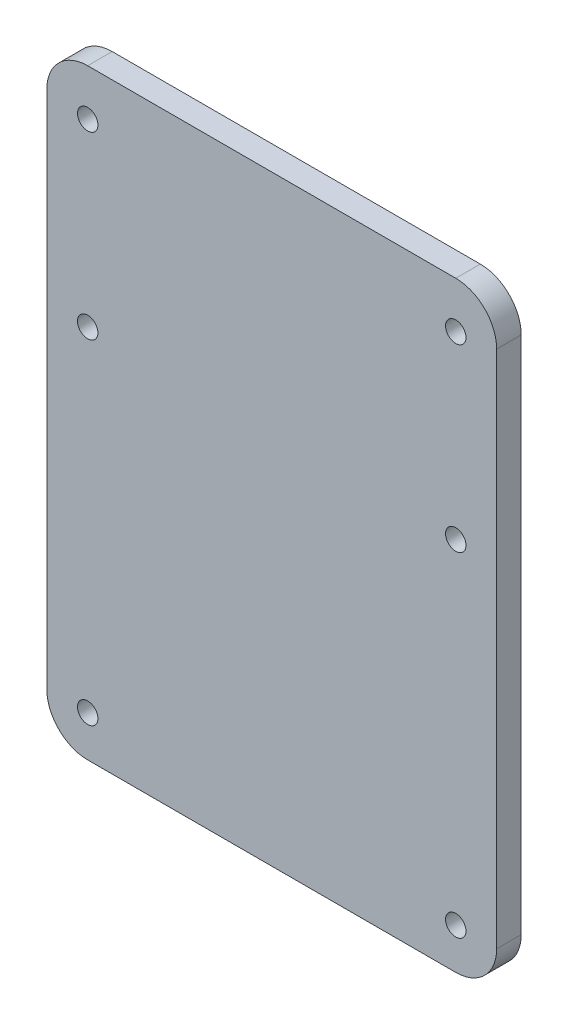
ISO-10303-21;
HEADER;
FILE_DESCRIPTION(('STEP AP214'),'2;1');
FILE_NAME('part.step','',(''),(''),'','','');
FILE_SCHEMA(('AUTOMOTIVE_DESIGN { 1 0 10303 214 1 1 1 1 }'));
ENDSEC;
DATA;
#1=APPLICATION_CONTEXT('core data for automotive mechanical design processes');
#2=APPLICATION_PROTOCOL_DEFINITION('international standard','automotive_design',2000,#1);
#3=PRODUCT_CONTEXT('',#1,'mechanical');
#4=PRODUCT('Part','Part','',(#3));
#5=PRODUCT_RELATED_PRODUCT_CATEGORY('part','',(#4));
#6=PRODUCT_DEFINITION_FORMATION('','',#4);
#7=PRODUCT_DEFINITION_CONTEXT('part definition',#1,'design');
#8=PRODUCT_DEFINITION('design','',#6,#7);
#9=PRODUCT_DEFINITION_SHAPE('','',#8);
#10=(LENGTH_UNIT() NAMED_UNIT(*) SI_UNIT(.MILLI.,.METRE.));
#11=(NAMED_UNIT(*) PLANE_ANGLE_UNIT() SI_UNIT($,.RADIAN.));
#12=(NAMED_UNIT(*) SI_UNIT($,.STERADIAN.) SOLID_ANGLE_UNIT());
#13=UNCERTAINTY_MEASURE_WITH_UNIT(LENGTH_MEASURE(1.E-05),#10,'distance_accuracy_value','');
#14=(GEOMETRIC_REPRESENTATION_CONTEXT(3) GLOBAL_UNCERTAINTY_ASSIGNED_CONTEXT((#13)) GLOBAL_UNIT_ASSIGNED_CONTEXT((#10,
#11,#12)) REPRESENTATION_CONTEXT('',''));
#15=CARTESIAN_POINT('',(0.,0.,0.));
#16=DIRECTION('',(0.,0.,1.));
#17=DIRECTION('',(1.,0.,0.));
#18=AXIS2_PLACEMENT_3D('',#15,#16,#17);
#19=CARTESIAN_POINT('',(-25.7371794871795,42.2489316239316,3.));
#20=DIRECTION('',(1.,0.,0.));
#21=DIRECTION('',(0.,1.,0.));
#22=AXIS2_PLACEMENT_3D('',#19,#20,#21);
#23=PLANE('',#22);
#24=DIRECTION('',(0.,-1.,0.));
#25=VECTOR('',#24,1.);
#26=CARTESIAN_POINT('',(-25.7371794871795,42.2489316239316,0.));
#27=LINE('',#26,#25);
#28=CARTESIAN_POINT('',(-25.7371794871795,37.2489316239316,0.));
#29=VERTEX_POINT('',#28);
#30=CARTESIAN_POINT('',(-25.7371794871795,-26.2510683760684,0.));
#31=VERTEX_POINT('',#30);
#32=EDGE_CURVE('E146',#29,#31,#27,.T.);
#33=ORIENTED_EDGE('',*,*,#32,.T.);
#34=DIRECTION('',(0.,0.,-1.));
#35=VECTOR('',#34,1.);
#36=CARTESIAN_POINT('',(-25.7371794871795,-26.2510683760684,3.));
#37=LINE('',#36,#35);
#38=CARTESIAN_POINT('',(-25.7371794871795,-26.2510683760684,3.));
#39=VERTEX_POINT('',#38);
#40=EDGE_CURVE('E180',#31,#39,#37,.F.);
#41=ORIENTED_EDGE('',*,*,#40,.T.);
#42=DIRECTION('',(0.,-1.,0.));
#43=VECTOR('',#42,1.);
#44=CARTESIAN_POINT('',(-25.7371794871795,42.2489316239316,3.));
#45=LINE('',#44,#43);
#46=CARTESIAN_POINT('',(-25.7371794871795,37.2489316239316,3.));
#47=VERTEX_POINT('',#46);
#48=EDGE_CURVE('E144',#47,#39,#45,.T.);
#49=ORIENTED_EDGE('',*,*,#48,.F.);
#50=DIRECTION('',(0.,0.,-1.));
#51=VECTOR('',#50,1.);
#52=CARTESIAN_POINT('',(-25.7371794871795,37.2489316239316,3.));
#53=LINE('',#52,#51);
#54=EDGE_CURVE('E176',#47,#29,#53,.T.);
#55=ORIENTED_EDGE('',*,*,#54,.T.);
#56=EDGE_LOOP('',(#33,#41,#49,#55));
#57=FACE_BOUND('',#56,.T.);
#58=ADVANCED_FACE('F45',(#57),#23,.F.);
#59=CARTESIAN_POINT('',(-25.7371794871795,-31.2510683760684,3.));
#60=DIRECTION('',(0.,1.,0.));
#61=DIRECTION('',(0.,0.,1.));
#62=AXIS2_PLACEMENT_3D('',#59,#60,#61);
#63=PLANE('',#62);
#64=DIRECTION('',(1.,0.,0.));
#65=VECTOR('',#64,1.);
#66=CARTESIAN_POINT('',(-25.7371794871795,-31.2510683760684,0.));
#67=LINE('',#66,#65);
#68=CARTESIAN_POINT('',(-20.7371794871795,-31.2510683760684,0.));
#69=VERTEX_POINT('',#68);
#70=CARTESIAN_POINT('',(24.2628205128205,-31.2510683760684,0.));
#71=VERTEX_POINT('',#70);
#72=EDGE_CURVE('E140',#69,#71,#67,.T.);
#73=ORIENTED_EDGE('',*,*,#72,.T.);
#74=DIRECTION('',(0.,0.,-1.));
#75=VECTOR('',#74,1.);
#76=CARTESIAN_POINT('',(24.2628205128205,-31.2510683760684,3.));
#77=LINE('',#76,#75);
#78=CARTESIAN_POINT('',(24.2628205128205,-31.2510683760684,3.));
#79=VERTEX_POINT('',#78);
#80=EDGE_CURVE('E116',#71,#79,#77,.F.);
#81=ORIENTED_EDGE('',*,*,#80,.T.);
#82=DIRECTION('',(1.,0.,0.));
#83=VECTOR('',#82,1.);
#84=CARTESIAN_POINT('',(-25.7371794871795,-31.2510683760684,3.));
#85=LINE('',#84,#83);
#86=CARTESIAN_POINT('',(-20.7371794871795,-31.2510683760684,3.));
#87=VERTEX_POINT('',#86);
#88=EDGE_CURVE('E199',#87,#79,#85,.T.);
#89=ORIENTED_EDGE('',*,*,#88,.F.);
#90=DIRECTION('',(0.,0.,-1.));
#91=VECTOR('',#90,1.);
#92=CARTESIAN_POINT('',(-20.7371794871795,-31.2510683760684,3.));
#93=LINE('',#92,#91);
#94=EDGE_CURVE('E122',#87,#69,#93,.T.);
#95=ORIENTED_EDGE('',*,*,#94,.T.);
#96=EDGE_LOOP('',(#73,#81,#89,#95));
#97=FACE_BOUND('',#96,.T.);
#98=ADVANCED_FACE('F272',(#97),#63,.F.);
#99=CARTESIAN_POINT('',(29.2628205128205,42.2489316239316,3.));
#100=DIRECTION('',(-1.,0.,0.));
#101=DIRECTION('',(0.,-1.,0.));
#102=AXIS2_PLACEMENT_3D('',#99,#100,#101);
#103=PLANE('',#102);
#104=DIRECTION('',(0.,1.,0.));
#105=VECTOR('',#104,1.);
#106=CARTESIAN_POINT('',(29.2628205128205,42.2489316239316,3.));
#107=LINE('',#106,#105);
#108=CARTESIAN_POINT('',(29.2628205128205,-26.2510683760684,3.));
#109=VERTEX_POINT('',#108);
#110=CARTESIAN_POINT('',(29.2628205128205,37.2489316239316,3.));
#111=VERTEX_POINT('',#110);
#112=EDGE_CURVE('E131',#109,#111,#107,.T.);
#113=ORIENTED_EDGE('',*,*,#112,.F.);
#114=DIRECTION('',(0.,0.,-1.));
#115=VECTOR('',#114,1.);
#116=CARTESIAN_POINT('',(29.2628205128205,-26.2510683760684,3.));
#117=LINE('',#116,#115);
#118=CARTESIAN_POINT('',(29.2628205128205,-26.2510683760684,0.));
#119=VERTEX_POINT('',#118);
#120=EDGE_CURVE('E115',#109,#119,#117,.T.);
#121=ORIENTED_EDGE('',*,*,#120,.T.);
#122=DIRECTION('',(0.,1.,0.));
#123=VECTOR('',#122,1.);
#124=CARTESIAN_POINT('',(29.2628205128205,42.2489316239316,0.));
#125=LINE('',#124,#123);
#126=CARTESIAN_POINT('',(29.2628205128205,37.2489316239316,0.));
#127=VERTEX_POINT('',#126);
#128=EDGE_CURVE('E129',#119,#127,#125,.T.);
#129=ORIENTED_EDGE('',*,*,#128,.T.);
#130=DIRECTION('',(0.,0.,-1.));
#131=VECTOR('',#130,1.);
#132=CARTESIAN_POINT('',(29.2628205128205,37.2489316239316,3.));
#133=LINE('',#132,#131);
#134=EDGE_CURVE('E134',#127,#111,#133,.F.);
#135=ORIENTED_EDGE('',*,*,#134,.T.);
#136=EDGE_LOOP('',(#113,#121,#129,#135));
#137=FACE_BOUND('',#136,.T.);
#138=ADVANCED_FACE('F128',(#137),#103,.F.);
#139=CARTESIAN_POINT('',(-25.7371794871795,42.2489316239316,3.));
#140=DIRECTION('',(0.,-1.,0.));
#141=DIRECTION('',(0.,0.,-1.));
#142=AXIS2_PLACEMENT_3D('',#139,#140,#141);
#143=PLANE('',#142);
#144=DIRECTION('',(-1.,0.,0.));
#145=VECTOR('',#144,1.);
#146=CARTESIAN_POINT('',(-25.7371794871795,42.2489316239316,0.));
#147=LINE('',#146,#145);
#148=CARTESIAN_POINT('',(24.2628205128205,42.2489316239316,0.));
#149=VERTEX_POINT('',#148);
#150=CARTESIAN_POINT('',(-20.7371794871795,42.2489316239316,0.));
#151=VERTEX_POINT('',#150);
#152=EDGE_CURVE('E139',#149,#151,#147,.T.);
#153=ORIENTED_EDGE('',*,*,#152,.T.);
#154=DIRECTION('',(0.,0.,-1.));
#155=VECTOR('',#154,1.);
#156=CARTESIAN_POINT('',(-20.7371794871795,42.2489316239316,3.));
#157=LINE('',#156,#155);
#158=CARTESIAN_POINT('',(-20.7371794871795,42.2489316239316,3.));
#159=VERTEX_POINT('',#158);
#160=EDGE_CURVE('E11',#151,#159,#157,.F.);
#161=ORIENTED_EDGE('',*,*,#160,.T.);
#162=DIRECTION('',(-1.,0.,0.));
#163=VECTOR('',#162,1.);
#164=CARTESIAN_POINT('',(-25.7371794871795,42.2489316239316,3.));
#165=LINE('',#164,#163);
#166=CARTESIAN_POINT('',(24.2628205128205,42.2489316239316,3.));
#167=VERTEX_POINT('',#166);
#168=EDGE_CURVE('E151',#167,#159,#165,.T.);
#169=ORIENTED_EDGE('',*,*,#168,.F.);
#170=DIRECTION('',(0.,0.,-1.));
#171=VECTOR('',#170,1.);
#172=CARTESIAN_POINT('',(24.2628205128205,42.2489316239316,3.));
#173=LINE('',#172,#171);
#174=EDGE_CURVE('E54',#167,#149,#173,.T.);
#175=ORIENTED_EDGE('',*,*,#174,.T.);
#176=EDGE_LOOP('',(#153,#161,#169,#175));
#177=FACE_BOUND('',#176,.T.);
#178=ADVANCED_FACE('F185',(#177),#143,.F.);
#179=CARTESIAN_POINT('',(0.,0.,3.));
#180=DIRECTION('',(0.,0.,1.));
#181=DIRECTION('',(1.,0.,0.));
#182=AXIS2_PLACEMENT_3D('',#179,#180,#181);
#183=PLANE('',#182);
#184=CARTESIAN_POINT('',(-20.7371794871795,-26.2510683760684,3.));
#185=DIRECTION('',(0.,0.,1.));
#186=DIRECTION('',(1.,0.,0.));
#187=AXIS2_PLACEMENT_3D('',#184,#185,#186);
#188=CIRCLE('',#187,1.25);
#189=CARTESIAN_POINT('',(-19.4871794871795,-26.2510683760684,3.));
#190=VERTEX_POINT('',#189);
#191=EDGE_CURVE('E241',#190,#190,#188,.T.);
#192=ORIENTED_EDGE('',*,*,#191,.F.);
#193=EDGE_LOOP('',(#192));
#194=FACE_BOUND('',#193,.T.);
#195=CARTESIAN_POINT('',(24.2628205128205,14.58796733645,3.));
#196=DIRECTION('',(0.,0.,1.));
#197=DIRECTION('',(1.,0.,0.));
#198=AXIS2_PLACEMENT_3D('',#195,#196,#197);
#199=CIRCLE('',#198,1.25);
#200=CARTESIAN_POINT('',(25.5128205128205,14.58796733645,3.));
#201=VERTEX_POINT('',#200);
#202=EDGE_CURVE('E226',#201,#201,#199,.T.);
#203=ORIENTED_EDGE('',*,*,#202,.F.);
#204=EDGE_LOOP('',(#203));
#205=FACE_BOUND('',#204,.T.);
#206=CARTESIAN_POINT('',(-20.7371794871795,14.58796733645,3.));
#207=DIRECTION('',(0.,0.,1.));
#208=DIRECTION('',(1.,0.,0.));
#209=AXIS2_PLACEMENT_3D('',#206,#207,#208);
#210=CIRCLE('',#209,1.25);
#211=CARTESIAN_POINT('',(-19.4871794871795,14.58796733645,3.));
#212=VERTEX_POINT('',#211);
#213=EDGE_CURVE('E225',#212,#212,#210,.T.);
#214=ORIENTED_EDGE('',*,*,#213,.F.);
#215=EDGE_LOOP('',(#214));
#216=FACE_BOUND('',#215,.T.);
#217=CARTESIAN_POINT('',(24.2628205128205,36.58796733645,3.));
#218=DIRECTION('',(0.,0.,1.));
#219=DIRECTION('',(1.,0.,0.));
#220=AXIS2_PLACEMENT_3D('',#217,#218,#219);
#221=CIRCLE('',#220,1.25);
#222=CARTESIAN_POINT('',(25.5128205128205,36.58796733645,3.));
#223=VERTEX_POINT('',#222);
#224=EDGE_CURVE('E219',#223,#223,#221,.T.);
#225=ORIENTED_EDGE('',*,*,#224,.F.);
#226=EDGE_LOOP('',(#225));
#227=FACE_BOUND('',#226,.T.);
#228=CARTESIAN_POINT('',(24.2628205128205,-26.2510683760684,3.));
#229=DIRECTION('',(0.,0.,1.));
#230=DIRECTION('',(1.,0.,0.));
#231=AXIS2_PLACEMENT_3D('',#228,#229,#230);
#232=CIRCLE('',#231,1.25);
#233=CARTESIAN_POINT('',(25.5128205128205,-26.2510683760684,3.));
#234=VERTEX_POINT('',#233);
#235=EDGE_CURVE('E242',#234,#234,#232,.T.);
#236=ORIENTED_EDGE('',*,*,#235,.F.);
#237=EDGE_LOOP('',(#236));
#238=FACE_BOUND('',#237,.T.);
#239=CARTESIAN_POINT('',(-20.7371794871795,36.58796733645,3.));
#240=DIRECTION('',(0.,0.,1.));
#241=DIRECTION('',(1.,0.,0.));
#242=AXIS2_PLACEMENT_3D('',#239,#240,#241);
#243=CIRCLE('',#242,1.25);
#244=CARTESIAN_POINT('',(-19.4871794871795,36.58796733645,3.));
#245=VERTEX_POINT('',#244);
#246=EDGE_CURVE('E205',#245,#245,#243,.T.);
#247=ORIENTED_EDGE('',*,*,#246,.F.);
#248=EDGE_LOOP('',(#247));
#249=FACE_BOUND('',#248,.T.);
#250=ORIENTED_EDGE('',*,*,#88,.T.);
#251=CARTESIAN_POINT('',(24.2628205128205,-26.2510683760684,3.));
#252=DIRECTION('',(0.,0.,1.));
#253=DIRECTION('',(1.,0.,0.));
#254=AXIS2_PLACEMENT_3D('',#251,#252,#253);
#255=CIRCLE('',#254,5.);
#256=EDGE_CURVE('E173',#79,#109,#255,.T.);
#257=ORIENTED_EDGE('',*,*,#256,.T.);
#258=ORIENTED_EDGE('',*,*,#112,.T.);
#259=CARTESIAN_POINT('',(24.2628205128205,37.2489316239316,3.));
#260=DIRECTION('',(0.,0.,1.));
#261=DIRECTION('',(1.,0.,0.));
#262=AXIS2_PLACEMENT_3D('',#259,#260,#261);
#263=CIRCLE('',#262,5.);
#264=EDGE_CURVE('E66',#111,#167,#263,.T.);
#265=ORIENTED_EDGE('',*,*,#264,.T.);
#266=ORIENTED_EDGE('',*,*,#168,.T.);
#267=CARTESIAN_POINT('',(-20.7371794871795,37.2489316239316,3.));
#268=DIRECTION('',(0.,0.,1.));
#269=DIRECTION('',(1.,0.,0.));
#270=AXIS2_PLACEMENT_3D('',#267,#268,#269);
#271=CIRCLE('',#270,5.);
#272=EDGE_CURVE('E167',#159,#47,#271,.T.);
#273=ORIENTED_EDGE('',*,*,#272,.T.);
#274=ORIENTED_EDGE('',*,*,#48,.T.);
#275=CARTESIAN_POINT('',(-20.7371794871795,-26.2510683760684,3.));
#276=DIRECTION('',(0.,0.,1.));
#277=DIRECTION('',(1.,0.,0.));
#278=AXIS2_PLACEMENT_3D('',#275,#276,#277);
#279=CIRCLE('',#278,5.);
#280=EDGE_CURVE('E170',#39,#87,#279,.T.);
#281=ORIENTED_EDGE('',*,*,#280,.T.);
#282=EDGE_LOOP('',(#250,#257,#258,#265,#266,#273,#274,#281));
#283=FACE_BOUND('',#282,.T.);
#284=ADVANCED_FACE('F263',(#194,#205,#216,#227,#238,#249,#283),#183,.T.);
#285=CARTESIAN_POINT('',(0.,0.,0.));
#286=DIRECTION('',(0.,0.,1.));
#287=DIRECTION('',(1.,0.,0.));
#288=AXIS2_PLACEMENT_3D('',#285,#286,#287);
#289=PLANE('',#288);
#290=CARTESIAN_POINT('',(-20.7371794871795,-26.2510683760684,0.));
#291=DIRECTION('',(0.,0.,1.));
#292=DIRECTION('',(1.,0.,0.));
#293=AXIS2_PLACEMENT_3D('',#290,#291,#292);
#294=CIRCLE('',#293,1.25);
#295=CARTESIAN_POINT('',(-19.4871794871795,-26.2510683760684,0.));
#296=VERTEX_POINT('',#295);
#297=EDGE_CURVE('E237',#296,#296,#294,.T.);
#298=ORIENTED_EDGE('',*,*,#297,.T.);
#299=EDGE_LOOP('',(#298));
#300=FACE_BOUND('',#299,.T.);
#301=CARTESIAN_POINT('',(24.2628205128205,14.58796733645,0.));
#302=DIRECTION('',(0.,0.,1.));
#303=DIRECTION('',(1.,0.,0.));
#304=AXIS2_PLACEMENT_3D('',#301,#302,#303);
#305=CIRCLE('',#304,1.25);
#306=CARTESIAN_POINT('',(25.5128205128205,14.58796733645,0.));
#307=VERTEX_POINT('',#306);
#308=EDGE_CURVE('E246',#307,#307,#305,.T.);
#309=ORIENTED_EDGE('',*,*,#308,.T.);
#310=EDGE_LOOP('',(#309));
#311=FACE_BOUND('',#310,.T.);
#312=CARTESIAN_POINT('',(-20.7371794871795,14.58796733645,0.));
#313=DIRECTION('',(0.,0.,1.));
#314=DIRECTION('',(1.,0.,0.));
#315=AXIS2_PLACEMENT_3D('',#312,#313,#314);
#316=CIRCLE('',#315,1.25);
#317=CARTESIAN_POINT('',(-19.4871794871795,14.58796733645,0.));
#318=VERTEX_POINT('',#317);
#319=EDGE_CURVE('E221',#318,#318,#316,.T.);
#320=ORIENTED_EDGE('',*,*,#319,.T.);
#321=EDGE_LOOP('',(#320));
#322=FACE_BOUND('',#321,.T.);
#323=CARTESIAN_POINT('',(24.2628205128205,36.58796733645,0.));
#324=DIRECTION('',(0.,0.,1.));
#325=DIRECTION('',(1.,0.,0.));
#326=AXIS2_PLACEMENT_3D('',#323,#324,#325);
#327=CIRCLE('',#326,1.25);
#328=CARTESIAN_POINT('',(25.5128205128205,36.58796733645,0.));
#329=VERTEX_POINT('',#328);
#330=EDGE_CURVE('E230',#329,#329,#327,.T.);
#331=ORIENTED_EDGE('',*,*,#330,.T.);
#332=EDGE_LOOP('',(#331));
#333=FACE_BOUND('',#332,.T.);
#334=CARTESIAN_POINT('',(24.2628205128205,-26.2510683760684,0.));
#335=DIRECTION('',(0.,0.,1.));
#336=DIRECTION('',(1.,0.,0.));
#337=AXIS2_PLACEMENT_3D('',#334,#335,#336);
#338=CIRCLE('',#337,1.25);
#339=CARTESIAN_POINT('',(25.5128205128205,-26.2510683760684,0.));
#340=VERTEX_POINT('',#339);
#341=EDGE_CURVE('E253',#340,#340,#338,.T.);
#342=ORIENTED_EDGE('',*,*,#341,.T.);
#343=EDGE_LOOP('',(#342));
#344=FACE_BOUND('',#343,.T.);
#345=CARTESIAN_POINT('',(-20.7371794871795,36.58796733645,0.));
#346=DIRECTION('',(0.,0.,1.));
#347=DIRECTION('',(1.,0.,0.));
#348=AXIS2_PLACEMENT_3D('',#345,#346,#347);
#349=CIRCLE('',#348,1.25);
#350=CARTESIAN_POINT('',(-19.4871794871795,36.58796733645,0.));
#351=VERTEX_POINT('',#350);
#352=EDGE_CURVE('E212',#351,#351,#349,.T.);
#353=ORIENTED_EDGE('',*,*,#352,.T.);
#354=EDGE_LOOP('',(#353));
#355=FACE_BOUND('',#354,.T.);
#356=ORIENTED_EDGE('',*,*,#128,.F.);
#357=CARTESIAN_POINT('',(24.2628205128205,-26.2510683760684,0.));
#358=DIRECTION('',(0.,0.,1.));
#359=DIRECTION('',(1.,0.,0.));
#360=AXIS2_PLACEMENT_3D('',#357,#358,#359);
#361=CIRCLE('',#360,5.);
#362=EDGE_CURVE('E111',#119,#71,#361,.F.);
#363=ORIENTED_EDGE('',*,*,#362,.T.);
#364=ORIENTED_EDGE('',*,*,#72,.F.);
#365=CARTESIAN_POINT('',(-20.7371794871795,-26.2510683760684,0.));
#366=DIRECTION('',(0.,0.,1.));
#367=DIRECTION('',(1.,0.,0.));
#368=AXIS2_PLACEMENT_3D('',#365,#366,#367);
#369=CIRCLE('',#368,5.);
#370=EDGE_CURVE('E123',#69,#31,#369,.F.);
#371=ORIENTED_EDGE('',*,*,#370,.T.);
#372=ORIENTED_EDGE('',*,*,#32,.F.);
#373=CARTESIAN_POINT('',(-20.7371794871795,37.2489316239316,0.));
#374=DIRECTION('',(0.,0.,1.));
#375=DIRECTION('',(1.,0.,0.));
#376=AXIS2_PLACEMENT_3D('',#373,#374,#375);
#377=CIRCLE('',#376,5.);
#378=EDGE_CURVE('E155',#29,#151,#377,.F.);
#379=ORIENTED_EDGE('',*,*,#378,.T.);
#380=ORIENTED_EDGE('',*,*,#152,.F.);
#381=CARTESIAN_POINT('',(24.2628205128205,37.2489316239316,0.));
#382=DIRECTION('',(0.,0.,1.));
#383=DIRECTION('',(1.,0.,0.));
#384=AXIS2_PLACEMENT_3D('',#381,#382,#383);
#385=CIRCLE('',#384,5.);
#386=EDGE_CURVE('E133',#149,#127,#385,.F.);
#387=ORIENTED_EDGE('',*,*,#386,.T.);
#388=EDGE_LOOP('',(#356,#363,#364,#371,#372,#379,#380,#387));
#389=FACE_BOUND('',#388,.T.);
#390=ADVANCED_FACE('F136',(#300,#311,#322,#333,#344,#355,#389),#289,.F.);
#391=CARTESIAN_POINT('',(-20.7371794871795,36.58796733645,0.));
#392=DIRECTION('',(0.,0.,1.));
#393=DIRECTION('',(1.,0.,0.));
#394=AXIS2_PLACEMENT_3D('',#391,#392,#393);
#395=CYLINDRICAL_SURFACE('',#394,1.25);
#396=ORIENTED_EDGE('',*,*,#352,.F.);
#397=EDGE_LOOP('',(#396));
#398=FACE_BOUND('',#397,.T.);
#399=ORIENTED_EDGE('',*,*,#246,.T.);
#400=EDGE_LOOP('',(#399));
#401=FACE_BOUND('',#400,.T.);
#402=ADVANCED_FACE('F296',(#398,#401),#395,.F.);
#403=CARTESIAN_POINT('',(24.2628205128205,-26.2510683760684,0.));
#404=DIRECTION('',(0.,0.,1.));
#405=DIRECTION('',(1.,0.,0.));
#406=AXIS2_PLACEMENT_3D('',#403,#404,#405);
#407=CYLINDRICAL_SURFACE('',#406,1.25);
#408=ORIENTED_EDGE('',*,*,#341,.F.);
#409=EDGE_LOOP('',(#408));
#410=FACE_BOUND('',#409,.T.);
#411=ORIENTED_EDGE('',*,*,#235,.T.);
#412=EDGE_LOOP('',(#411));
#413=FACE_BOUND('',#412,.T.);
#414=ADVANCED_FACE('F261',(#410,#413),#407,.F.);
#415=CARTESIAN_POINT('',(24.2628205128205,36.58796733645,0.));
#416=DIRECTION('',(0.,0.,1.));
#417=DIRECTION('',(1.,0.,0.));
#418=AXIS2_PLACEMENT_3D('',#415,#416,#417);
#419=CYLINDRICAL_SURFACE('',#418,1.25);
#420=ORIENTED_EDGE('',*,*,#330,.F.);
#421=EDGE_LOOP('',(#420));
#422=FACE_BOUND('',#421,.T.);
#423=ORIENTED_EDGE('',*,*,#224,.T.);
#424=EDGE_LOOP('',(#423));
#425=FACE_BOUND('',#424,.T.);
#426=ADVANCED_FACE('F306',(#422,#425),#419,.F.);
#427=CARTESIAN_POINT('',(-20.7371794871795,14.58796733645,0.));
#428=DIRECTION('',(0.,0.,1.));
#429=DIRECTION('',(1.,0.,0.));
#430=AXIS2_PLACEMENT_3D('',#427,#428,#429);
#431=CYLINDRICAL_SURFACE('',#430,1.25);
#432=ORIENTED_EDGE('',*,*,#319,.F.);
#433=EDGE_LOOP('',(#432));
#434=FACE_BOUND('',#433,.T.);
#435=ORIENTED_EDGE('',*,*,#213,.T.);
#436=EDGE_LOOP('',(#435));
#437=FACE_BOUND('',#436,.T.);
#438=ADVANCED_FACE('F302',(#434,#437),#431,.F.);
#439=CARTESIAN_POINT('',(24.2628205128205,14.58796733645,0.));
#440=DIRECTION('',(0.,0.,1.));
#441=DIRECTION('',(1.,0.,0.));
#442=AXIS2_PLACEMENT_3D('',#439,#440,#441);
#443=CYLINDRICAL_SURFACE('',#442,1.25);
#444=ORIENTED_EDGE('',*,*,#308,.F.);
#445=EDGE_LOOP('',(#444));
#446=FACE_BOUND('',#445,.T.);
#447=ORIENTED_EDGE('',*,*,#202,.T.);
#448=EDGE_LOOP('',(#447));
#449=FACE_BOUND('',#448,.T.);
#450=ADVANCED_FACE('F305',(#446,#449),#443,.F.);
#451=CARTESIAN_POINT('',(-20.7371794871795,-26.2510683760684,0.));
#452=DIRECTION('',(0.,0.,1.));
#453=DIRECTION('',(1.,0.,0.));
#454=AXIS2_PLACEMENT_3D('',#451,#452,#453);
#455=CYLINDRICAL_SURFACE('',#454,1.25);
#456=ORIENTED_EDGE('',*,*,#297,.F.);
#457=EDGE_LOOP('',(#456));
#458=FACE_BOUND('',#457,.T.);
#459=ORIENTED_EDGE('',*,*,#191,.T.);
#460=EDGE_LOOP('',(#459));
#461=FACE_BOUND('',#460,.T.);
#462=ADVANCED_FACE('F281',(#458,#461),#455,.F.);
#463=CARTESIAN_POINT('',(24.2628205128205,-26.2510683760684,3.));
#464=DIRECTION('',(0.,0.,-1.));
#465=DIRECTION('',(-1.,0.,0.));
#466=AXIS2_PLACEMENT_3D('',#463,#464,#465);
#467=CYLINDRICAL_SURFACE('',#466,5.);
#468=ORIENTED_EDGE('',*,*,#256,.F.);
#469=ORIENTED_EDGE('',*,*,#80,.F.);
#470=ORIENTED_EDGE('',*,*,#362,.F.);
#471=ORIENTED_EDGE('',*,*,#120,.F.);
#472=EDGE_LOOP('',(#468,#469,#470,#471));
#473=FACE_BOUND('',#472,.T.);
#474=ADVANCED_FACE('F114',(#473),#467,.T.);
#475=CARTESIAN_POINT('',(-20.7371794871795,-26.2510683760684,3.));
#476=DIRECTION('',(0.,0.,-1.));
#477=DIRECTION('',(-1.,0.,0.));
#478=AXIS2_PLACEMENT_3D('',#475,#476,#477);
#479=CYLINDRICAL_SURFACE('',#478,5.);
#480=ORIENTED_EDGE('',*,*,#280,.F.);
#481=ORIENTED_EDGE('',*,*,#40,.F.);
#482=ORIENTED_EDGE('',*,*,#370,.F.);
#483=ORIENTED_EDGE('',*,*,#94,.F.);
#484=EDGE_LOOP('',(#480,#481,#482,#483));
#485=FACE_BOUND('',#484,.T.);
#486=ADVANCED_FACE('F274',(#485),#479,.T.);
#487=CARTESIAN_POINT('',(-20.7371794871795,37.2489316239316,3.));
#488=DIRECTION('',(0.,0.,-1.));
#489=DIRECTION('',(-1.,0.,0.));
#490=AXIS2_PLACEMENT_3D('',#487,#488,#489);
#491=CYLINDRICAL_SURFACE('',#490,5.);
#492=ORIENTED_EDGE('',*,*,#272,.F.);
#493=ORIENTED_EDGE('',*,*,#160,.F.);
#494=ORIENTED_EDGE('',*,*,#378,.F.);
#495=ORIENTED_EDGE('',*,*,#54,.F.);
#496=EDGE_LOOP('',(#492,#493,#494,#495));
#497=FACE_BOUND('',#496,.T.);
#498=ADVANCED_FACE('F192',(#497),#491,.T.);
#499=CARTESIAN_POINT('',(24.2628205128205,37.2489316239316,3.));
#500=DIRECTION('',(0.,0.,-1.));
#501=DIRECTION('',(-1.,0.,0.));
#502=AXIS2_PLACEMENT_3D('',#499,#500,#501);
#503=CYLINDRICAL_SURFACE('',#502,5.);
#504=ORIENTED_EDGE('',*,*,#264,.F.);
#505=ORIENTED_EDGE('',*,*,#134,.F.);
#506=ORIENTED_EDGE('',*,*,#386,.F.);
#507=ORIENTED_EDGE('',*,*,#174,.F.);
#508=EDGE_LOOP('',(#504,#505,#506,#507));
#509=FACE_BOUND('',#508,.T.);
#510=ADVANCED_FACE('F47',(#509),#503,.T.);
#511=CLOSED_SHELL('',(#58,#98,#138,#178,#284,#390,#402,#414,#426,#438,#450,#462,#474,#486,#498,#510));
#512=MANIFOLD_SOLID_BREP('B2',#511);
#513=ADVANCED_BREP_SHAPE_REPRESENTATION('',(#18,#512),#14);
#514=SHAPE_DEFINITION_REPRESENTATION(#9,#513);
ENDSEC;
END-ISO-10303-21;
